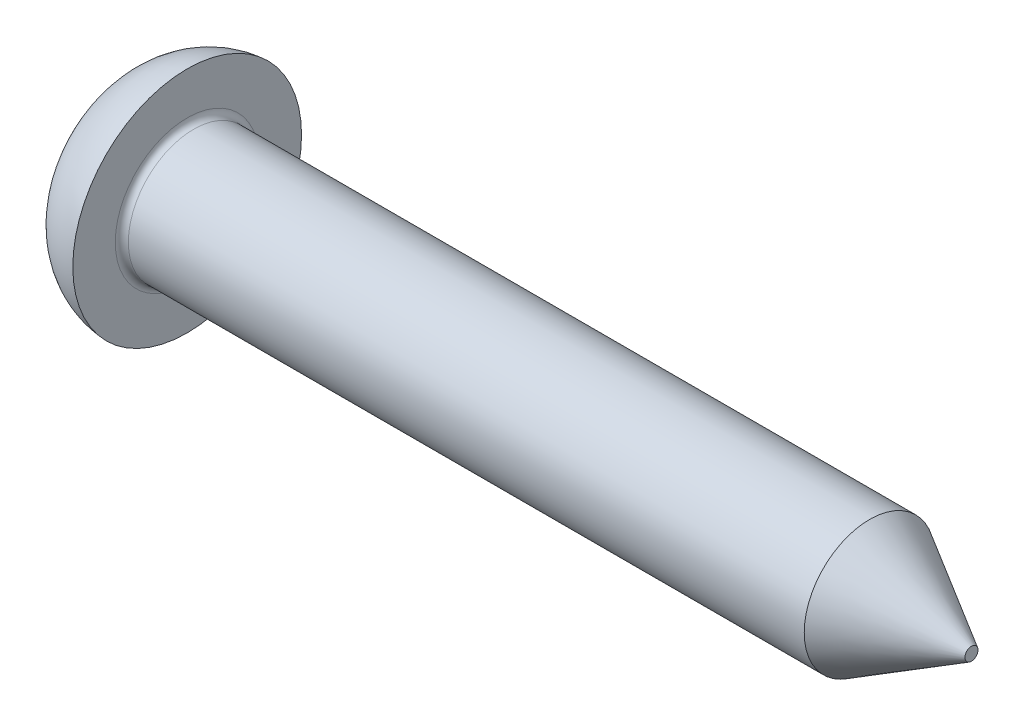
ISO-10303-21;
HEADER;
FILE_DESCRIPTION(('STEP AP214'),'2;1');
FILE_NAME('part.step','',(''),(''),'','','');
FILE_SCHEMA(('AUTOMOTIVE_DESIGN { 1 0 10303 214 1 1 1 1 }'));
ENDSEC;
DATA;
#1=APPLICATION_CONTEXT('core data for automotive mechanical design processes');
#2=APPLICATION_PROTOCOL_DEFINITION('international standard','automotive_design',2000,#1);
#3=PRODUCT_CONTEXT('',#1,'mechanical');
#4=PRODUCT('Part','Part','',(#3));
#5=PRODUCT_RELATED_PRODUCT_CATEGORY('part','',(#4));
#6=PRODUCT_DEFINITION_FORMATION('','',#4);
#7=PRODUCT_DEFINITION_CONTEXT('part definition',#1,'design');
#8=PRODUCT_DEFINITION('design','',#6,#7);
#9=PRODUCT_DEFINITION_SHAPE('','',#8);
#10=(LENGTH_UNIT() NAMED_UNIT(*) SI_UNIT(.MILLI.,.METRE.));
#11=(NAMED_UNIT(*) PLANE_ANGLE_UNIT() SI_UNIT($,.RADIAN.));
#12=(NAMED_UNIT(*) SI_UNIT($,.STERADIAN.) SOLID_ANGLE_UNIT());
#13=UNCERTAINTY_MEASURE_WITH_UNIT(LENGTH_MEASURE(1.E-05),#10,'distance_accuracy_value','');
#14=(GEOMETRIC_REPRESENTATION_CONTEXT(3) GLOBAL_UNCERTAINTY_ASSIGNED_CONTEXT((#13)) GLOBAL_UNIT_ASSIGNED_CONTEXT((#10,
#11,#12)) REPRESENTATION_CONTEXT('',''));
#15=CARTESIAN_POINT('',(0.,0.,0.));
#16=DIRECTION('',(0.,0.,1.));
#17=DIRECTION('',(1.,0.,0.));
#18=AXIS2_PLACEMENT_3D('',#15,#16,#17);
#19=CARTESIAN_POINT('',(2.1,0.,0.));
#20=DIRECTION('',(-1.,0.,0.));
#21=DIRECTION('',(0.,1.,0.));
#22=AXIS2_PLACEMENT_3D('',#19,#20,#21);
#23=SPHERICAL_SURFACE('',#22,2.1);
#24=CARTESIAN_POINT('',(0.443908039957306,0.,0.));
#25=DIRECTION('',(-1.,0.,0.));
#26=DIRECTION('',(0.,0.,1.));
#27=AXIS2_PLACEMENT_3D('',#24,#25,#26);
#28=CIRCLE('',#27,1.2912627230281);
#29=CARTESIAN_POINT('',(0.443908039957306,0.,1.2912627230281));
#30=VERTEX_POINT('',#29);
#31=EDGE_CURVE('E208',#30,#30,#28,.T.);
#32=ORIENTED_EDGE('',*,*,#31,.T.);
#33=EDGE_LOOP('',(#32));
#34=FACE_BOUND('',#33,.T.);
#35=CARTESIAN_POINT('',(0.0613546050321745,0.,0.));
#36=DIRECTION('',(1.,0.,0.));
#37=DIRECTION('',(0.,0.,-1.));
#38=AXIS2_PLACEMENT_3D('',#35,#36,#37);
#39=CIRCLE('',#38,0.503909668072047);
#40=CARTESIAN_POINT('',(0.061354605032363,-0.231,-0.447843670913397));
#41=VERTEX_POINT('',#40);
#42=CARTESIAN_POINT('',(0.0613546050321748,-0.447843670912608,-0.231));
#43=VERTEX_POINT('',#42);
#44=EDGE_CURVE('E392',#41,#43,#39,.F.);
#45=ORIENTED_EDGE('',*,*,#44,.F.);
#46=CARTESIAN_POINT('',(2.1,-0.231,0.));
#47=DIRECTION('',(0.,1.,0.));
#48=DIRECTION('',(0.,0.,1.));
#49=AXIS2_PLACEMENT_3D('',#46,#47,#48);
#50=CIRCLE('',#49,2.08725633308417);
#51=CARTESIAN_POINT('',(0.233233534269021,-0.230999999999997,-0.933714068878837));
#52=VERTEX_POINT('',#51);
#53=EDGE_CURVE('E411',#52,#41,#50,.T.);
#54=ORIENTED_EDGE('',*,*,#53,.F.);
#55=CARTESIAN_POINT('',(2.10118948688328,0.,-0.00238574199887259));
#56=DIRECTION('',(-0.446197753347435,0.,0.894934391398443));
#57=DIRECTION('',(0.894934391398443,0.,0.446197753347435));
#58=AXIS2_PLACEMENT_3D('',#55,#56,#57);
#59=CIRCLE('',#58,2.09999830794124);
#60=CARTESIAN_POINT('',(0.233233534269022,0.231000000000003,-0.933714068878836));
#61=VERTEX_POINT('',#60);
#62=EDGE_CURVE('E224',#61,#52,#59,.T.);
#63=ORIENTED_EDGE('',*,*,#62,.F.);
#64=CARTESIAN_POINT('',(2.1,0.231,0.));
#65=DIRECTION('',(0.,-1.,0.));
#66=DIRECTION('',(0.,0.,-1.));
#67=AXIS2_PLACEMENT_3D('',#64,#65,#66);
#68=CIRCLE('',#67,2.08725633308417);
#69=CARTESIAN_POINT('',(0.0613546050323631,0.231,-0.447843670913395));
#70=VERTEX_POINT('',#69);
#71=EDGE_CURVE('E402',#70,#61,#68,.T.);
#72=ORIENTED_EDGE('',*,*,#71,.F.);
#73=CARTESIAN_POINT('',(0.0613546050321748,0.447843670912608,-0.231));
#74=VERTEX_POINT('',#73);
#75=EDGE_CURVE('E283',#74,#70,#39,.F.);
#76=ORIENTED_EDGE('',*,*,#75,.F.);
#77=CARTESIAN_POINT('',(2.1,0.,-0.231));
#78=DIRECTION('',(0.,0.,1.));
#79=DIRECTION('',(1.,0.,0.));
#80=AXIS2_PLACEMENT_3D('',#77,#78,#79);
#81=CIRCLE('',#80,2.08725633308417);
#82=CARTESIAN_POINT('',(0.233233534269021,0.933714068878837,-0.231));
#83=VERTEX_POINT('',#82);
#84=EDGE_CURVE('E214',#83,#74,#81,.T.);
#85=ORIENTED_EDGE('',*,*,#84,.F.);
#86=CARTESIAN_POINT('',(2.10118948688328,0.00238574199887211,0.));
#87=DIRECTION('',(-0.446197753347436,-0.894934391398443,0.));
#88=DIRECTION('',(0.894934391398443,-0.446197753347436,0.));
#89=AXIS2_PLACEMENT_3D('',#86,#87,#88);
#90=CIRCLE('',#89,2.09999830794124);
#91=CARTESIAN_POINT('',(0.233233534269022,0.933714068878837,0.231));
#92=VERTEX_POINT('',#91);
#93=EDGE_CURVE('E205',#92,#83,#90,.T.);
#94=ORIENTED_EDGE('',*,*,#93,.F.);
#95=CARTESIAN_POINT('',(2.1,0.,0.231));
#96=DIRECTION('',(0.,0.,-1.));
#97=DIRECTION('',(-1.,0.,0.));
#98=AXIS2_PLACEMENT_3D('',#95,#96,#97);
#99=CIRCLE('',#98,2.08725633308417);
#100=CARTESIAN_POINT('',(0.0613546050321748,0.447843670912608,0.231));
#101=VERTEX_POINT('',#100);
#102=EDGE_CURVE('E56',#101,#92,#99,.T.);
#103=ORIENTED_EDGE('',*,*,#102,.F.);
#104=CARTESIAN_POINT('',(0.061354605032363,0.231,0.447843670913396));
#105=VERTEX_POINT('',#104);
#106=EDGE_CURVE('E391',#105,#101,#39,.F.);
#107=ORIENTED_EDGE('',*,*,#106,.F.);
#108=CARTESIAN_POINT('',(0.233233534269021,0.230999999999997,0.933714068878838));
#109=VERTEX_POINT('',#108);
#110=EDGE_CURVE('E407',#109,#105,#68,.T.);
#111=ORIENTED_EDGE('',*,*,#110,.F.);
#112=CARTESIAN_POINT('',(2.10118948688328,0.,0.0023857419988722));
#113=DIRECTION('',(-0.446197753347436,0.,-0.894934391398443));
#114=DIRECTION('',(-0.894934391398443,0.,0.446197753347436));
#115=AXIS2_PLACEMENT_3D('',#112,#113,#114);
#116=CIRCLE('',#115,2.09999830794124);
#117=CARTESIAN_POINT('',(0.233233534269022,-0.231000000000004,0.933714068878836));
#118=VERTEX_POINT('',#117);
#119=EDGE_CURVE('E222',#118,#109,#116,.T.);
#120=ORIENTED_EDGE('',*,*,#119,.F.);
#121=CARTESIAN_POINT('',(0.0613546050323631,-0.231,0.447843670913395));
#122=VERTEX_POINT('',#121);
#123=EDGE_CURVE('E344',#122,#118,#50,.T.);
#124=ORIENTED_EDGE('',*,*,#123,.F.);
#125=CARTESIAN_POINT('',(0.0613546050321748,-0.447843670912608,0.231));
#126=VERTEX_POINT('',#125);
#127=EDGE_CURVE('E387',#126,#122,#39,.F.);
#128=ORIENTED_EDGE('',*,*,#127,.F.);
#129=CARTESIAN_POINT('',(0.233233534269021,-0.933714068878836,0.231));
#130=VERTEX_POINT('',#129);
#131=EDGE_CURVE('E217',#130,#126,#99,.T.);
#132=ORIENTED_EDGE('',*,*,#131,.F.);
#133=CARTESIAN_POINT('',(2.10118948688328,-0.00238574199887259,0.));
#134=DIRECTION('',(-0.446197753347435,0.894934391398443,0.));
#135=DIRECTION('',(-0.894934391398443,-0.446197753347435,0.));
#136=AXIS2_PLACEMENT_3D('',#133,#134,#135);
#137=CIRCLE('',#136,2.09999830794124);
#138=CARTESIAN_POINT('',(0.233233534269022,-0.933714068878836,-0.231));
#139=VERTEX_POINT('',#138);
#140=EDGE_CURVE('E220',#139,#130,#137,.T.);
#141=ORIENTED_EDGE('',*,*,#140,.F.);
#142=EDGE_CURVE('E213',#43,#139,#81,.T.);
#143=ORIENTED_EDGE('',*,*,#142,.F.);
#144=EDGE_LOOP('',(#45,#54,#63,#72,#76,#85,#94,#103,#107,#111,#120,#124,#128,#132,#141,#143));
#145=FACE_BOUND('',#144,.T.);
#146=ADVANCED_FACE('F33',(#34,#145),#23,.T.);
#147=CARTESIAN_POINT('',(0.91,-0.596290812545844,0.231));
#148=DIRECTION('',(0.,0.,-1.));
#149=DIRECTION('',(-1.,0.,0.));
#150=AXIS2_PLACEMENT_3D('',#147,#148,#149);
#151=PLANE('',#150);
#152=ORIENTED_EDGE('',*,*,#131,.T.);
#153=CARTESIAN_POINT('',(0.0253406192590715,-0.450675416027531,0.231));
#154=CARTESIAN_POINT('',(0.17283619096145,-0.439104263502818,0.231));
#155=CARTESIAN_POINT('',(0.320322255429265,-0.42741437619178,0.231));
#156=CARTESIAN_POINT('',(0.615275382344517,-0.403797131000269,0.231));
#157=CARTESIAN_POINT('',(0.762742444790347,-0.391869773099751,0.231));
#158=CARTESIAN_POINT('',(0.91020000000001,-0.379823680392863,0.231));
#159=B_SPLINE_CURVE_WITH_KNOTS('',3,(#153,#154,#155,#156,#157,#158),.UNSPECIFIED.,.F.,.F.,(4,2,
4),(0.,0.443845844970914,0.887691727407606),.UNSPECIFIED.);
#160=CARTESIAN_POINT('',(0.91,-0.379840049022659,0.231));
#161=VERTEX_POINT('',#160);
#162=EDGE_CURVE('E261',#126,#161,#159,.T.);
#163=ORIENTED_EDGE('',*,*,#162,.T.);
#164=DIRECTION('',(0.,1.,0.));
#165=VECTOR('',#164,1.);
#166=CARTESIAN_POINT('',(0.91,-0.596290812545844,0.231));
#167=LINE('',#166,#165);
#168=CARTESIAN_POINT('',(0.91,-0.596290812545844,0.231));
#169=VERTEX_POINT('',#168);
#170=EDGE_CURVE('E341',#161,#169,#167,.F.);
#171=ORIENTED_EDGE('',*,*,#170,.T.);
#172=DIRECTION('',(0.894934391398443,0.446197753347436,0.));
#173=VECTOR('',#172,1.);
#174=CARTESIAN_POINT('',(0.,-1.05,0.231));
#175=LINE('',#174,#173);
#176=EDGE_CURVE('E366',#130,#169,#175,.T.);
#177=ORIENTED_EDGE('',*,*,#176,.F.);
#178=EDGE_LOOP('',(#152,#163,#171,#177));
#179=FACE_BOUND('',#178,.T.);
#180=ADVANCED_FACE('F163',(#179),#151,.T.);
#181=DIRECTION('',(0.,1.,0.));
#182=VECTOR('',#181,1.);
#183=CARTESIAN_POINT('',(0.91,-0.596290812545844,0.231));
#184=LINE('',#183,#182);
#185=CARTESIAN_POINT('',(0.91,0.596290812545845,0.231));
#186=VERTEX_POINT('',#185);
#187=CARTESIAN_POINT('',(0.91,0.379840049022659,0.231));
#188=VERTEX_POINT('',#187);
#189=EDGE_CURVE('E343',#186,#188,#184,.F.);
#190=ORIENTED_EDGE('',*,*,#189,.T.);
#191=CARTESIAN_POINT('',(0.9102,0.379823680392733,0.231));
#192=CARTESIAN_POINT('',(0.762742444790341,0.391869773099674,0.231));
#193=CARTESIAN_POINT('',(0.615275382344514,0.403797131000236,0.231));
#194=CARTESIAN_POINT('',(0.320322255429268,0.427414376191813,0.231));
#195=CARTESIAN_POINT('',(0.172836190961454,0.439104263502874,0.231));
#196=CARTESIAN_POINT('',(0.0253406192590771,0.450675416027601,0.231));
#197=B_SPLINE_CURVE_WITH_KNOTS('',3,(#191,#192,#193,#194,#195,#196),.UNSPECIFIED.,.F.,.F.,(4,2,
4),(0.,0.443845882436693,0.887691727407607),.UNSPECIFIED.);
#198=EDGE_CURVE('E248',#188,#101,#197,.T.);
#199=ORIENTED_EDGE('',*,*,#198,.T.);
#200=ORIENTED_EDGE('',*,*,#102,.T.);
#201=DIRECTION('',(0.894934391398443,-0.446197753347436,0.));
#202=VECTOR('',#201,1.);
#203=CARTESIAN_POINT('',(0.,1.05,0.231));
#204=LINE('',#203,#202);
#205=EDGE_CURVE('E356',#92,#186,#204,.T.);
#206=ORIENTED_EDGE('',*,*,#205,.T.);
#207=EDGE_LOOP('',(#190,#199,#200,#206));
#208=FACE_BOUND('',#207,.T.);
#209=ADVANCED_FACE('F170',(#208),#151,.T.);
#210=CARTESIAN_POINT('',(0.91,0.596290812545845,-0.231));
#211=DIRECTION('',(0.,0.,1.));
#212=DIRECTION('',(1.,0.,0.));
#213=AXIS2_PLACEMENT_3D('',#210,#211,#212);
#214=PLANE('',#213);
#215=DIRECTION('',(0.,1.,0.));
#216=VECTOR('',#215,1.);
#217=CARTESIAN_POINT('',(0.91,0.596290812545845,-0.231));
#218=LINE('',#217,#216);
#219=CARTESIAN_POINT('',(0.91,-0.596290812545845,-0.231));
#220=VERTEX_POINT('',#219);
#221=CARTESIAN_POINT('',(0.91,-0.379840049022659,-0.231));
#222=VERTEX_POINT('',#221);
#223=EDGE_CURVE('E351',#220,#222,#218,.T.);
#224=ORIENTED_EDGE('',*,*,#223,.T.);
#225=CARTESIAN_POINT('',(0.9102,-0.379823680392733,-0.231));
#226=CARTESIAN_POINT('',(0.762742444790341,-0.391869773099674,-0.231));
#227=CARTESIAN_POINT('',(0.615275382344514,-0.403797131000235,-0.231));
#228=CARTESIAN_POINT('',(0.320322255429268,-0.427414376191813,-0.231));
#229=CARTESIAN_POINT('',(0.172836190961455,-0.439104263502874,-0.231));
#230=CARTESIAN_POINT('',(0.0253406192590774,-0.450675416027601,-0.231));
#231=B_SPLINE_CURVE_WITH_KNOTS('',3,(#225,#226,#227,#228,#229,#230),.UNSPECIFIED.,.F.,.F.,(4,2,
4),(0.,0.443845882436692,0.887691727407606),.UNSPECIFIED.);
#232=EDGE_CURVE('E272',#222,#43,#231,.T.);
#233=ORIENTED_EDGE('',*,*,#232,.T.);
#234=ORIENTED_EDGE('',*,*,#142,.T.);
#235=DIRECTION('',(0.894934391398443,0.446197753347435,0.));
#236=VECTOR('',#235,1.);
#237=CARTESIAN_POINT('',(0.,-1.05,-0.231));
#238=LINE('',#237,#236);
#239=EDGE_CURVE('E362',#139,#220,#238,.T.);
#240=ORIENTED_EDGE('',*,*,#239,.T.);
#241=EDGE_LOOP('',(#224,#233,#234,#240));
#242=FACE_BOUND('',#241,.T.);
#243=ADVANCED_FACE('F293',(#242),#214,.T.);
#244=ORIENTED_EDGE('',*,*,#84,.T.);
#245=CARTESIAN_POINT('',(0.0253406192590715,0.45067541602753,-0.231));
#246=CARTESIAN_POINT('',(0.17283619096145,0.439104263502817,-0.231));
#247=CARTESIAN_POINT('',(0.320322255429265,0.427414376191779,-0.231));
#248=CARTESIAN_POINT('',(0.615275382344517,0.403797131000269,-0.231));
#249=CARTESIAN_POINT('',(0.762742444790347,0.391869773099751,-0.231));
#250=CARTESIAN_POINT('',(0.91020000000001,0.379823680392863,-0.231));
#251=B_SPLINE_CURVE_WITH_KNOTS('',3,(#245,#246,#247,#248,#249,#250),.UNSPECIFIED.,.F.,.F.,(4,2,
4),(0.,0.443845844970914,0.887691727407606),.UNSPECIFIED.);
#252=CARTESIAN_POINT('',(0.91,0.379840049022659,-0.231));
#253=VERTEX_POINT('',#252);
#254=EDGE_CURVE('E284',#74,#253,#251,.T.);
#255=ORIENTED_EDGE('',*,*,#254,.T.);
#256=DIRECTION('',(0.,1.,0.));
#257=VECTOR('',#256,1.);
#258=CARTESIAN_POINT('',(0.91,0.596290812545845,-0.231));
#259=LINE('',#258,#257);
#260=CARTESIAN_POINT('',(0.91,0.596290812545845,-0.231));
#261=VERTEX_POINT('',#260);
#262=EDGE_CURVE('E350',#253,#261,#259,.T.);
#263=ORIENTED_EDGE('',*,*,#262,.T.);
#264=DIRECTION('',(0.894934391398443,-0.446197753347436,0.));
#265=VECTOR('',#264,1.);
#266=CARTESIAN_POINT('',(0.,1.05,-0.231));
#267=LINE('',#266,#265);
#268=EDGE_CURVE('E360',#83,#261,#267,.T.);
#269=ORIENTED_EDGE('',*,*,#268,.F.);
#270=EDGE_LOOP('',(#244,#255,#263,#269));
#271=FACE_BOUND('',#270,.T.);
#272=ADVANCED_FACE('F297',(#271),#214,.T.);
#273=CARTESIAN_POINT('',(0.91,0.596290812545845,0.231));
#274=DIRECTION('',(1.,0.,0.));
#275=DIRECTION('',(0.,0.,-1.));
#276=AXIS2_PLACEMENT_3D('',#273,#274,#275);
#277=PLANE('',#276);
#278=CARTESIAN_POINT('',(0.91,0.,0.));
#279=DIRECTION('',(-1.,0.,0.));
#280=DIRECTION('',(0.,0.,1.));
#281=AXIS2_PLACEMENT_3D('',#278,#279,#280);
#282=CIRCLE('',#281,0.444566601131412);
#283=EDGE_CURVE('E380',#222,#161,#282,.T.);
#284=ORIENTED_EDGE('',*,*,#283,.F.);
#285=ORIENTED_EDGE('',*,*,#223,.F.);
#286=DIRECTION('',(0.,0.,1.));
#287=VECTOR('',#286,1.);
#288=CARTESIAN_POINT('',(0.910000000000001,-0.596290812545845,-0.231));
#289=LINE('',#288,#287);
#290=EDGE_CURVE('E347',#169,#220,#289,.F.);
#291=ORIENTED_EDGE('',*,*,#290,.F.);
#292=ORIENTED_EDGE('',*,*,#170,.F.);
#293=EDGE_LOOP('',(#284,#285,#291,#292));
#294=FACE_BOUND('',#293,.T.);
#295=ADVANCED_FACE('F304',(#294),#277,.F.);
#296=CARTESIAN_POINT('',(0.91,-0.231,0.379840049022659));
#297=VERTEX_POINT('',#296);
#298=CARTESIAN_POINT('',(0.91,0.231,0.379840049022661));
#299=VERTEX_POINT('',#298);
#300=EDGE_CURVE('E446',#297,#299,#282,.T.);
#301=ORIENTED_EDGE('',*,*,#300,.F.);
#302=DIRECTION('',(0.,0.,1.));
#303=VECTOR('',#302,1.);
#304=CARTESIAN_POINT('',(0.91,-0.231,-0.596290812545845));
#305=LINE('',#304,#303);
#306=CARTESIAN_POINT('',(0.91,-0.231,0.596290812545844));
#307=VERTEX_POINT('',#306);
#308=EDGE_CURVE('E326',#307,#297,#305,.F.);
#309=ORIENTED_EDGE('',*,*,#308,.F.);
#310=DIRECTION('',(0.,-1.,0.));
#311=VECTOR('',#310,1.);
#312=CARTESIAN_POINT('',(0.91,-0.231,0.596290812545844));
#313=LINE('',#312,#311);
#314=CARTESIAN_POINT('',(0.91,0.230999999999998,0.596290812545845));
#315=VERTEX_POINT('',#314);
#316=EDGE_CURVE('E337',#315,#307,#313,.T.);
#317=ORIENTED_EDGE('',*,*,#316,.F.);
#318=DIRECTION('',(0.,0.,1.));
#319=VECTOR('',#318,1.);
#320=CARTESIAN_POINT('',(0.91,0.230999999999998,0.596290812545845));
#321=LINE('',#320,#319);
#322=EDGE_CURVE('E332',#299,#315,#321,.T.);
#323=ORIENTED_EDGE('',*,*,#322,.F.);
#324=EDGE_LOOP('',(#301,#309,#317,#323));
#325=FACE_BOUND('',#324,.T.);
#326=ADVANCED_FACE('F306',(#325),#277,.F.);
#327=EDGE_CURVE('E445',#188,#253,#282,.T.);
#328=ORIENTED_EDGE('',*,*,#327,.F.);
#329=ORIENTED_EDGE('',*,*,#189,.F.);
#330=DIRECTION('',(0.,0.,1.));
#331=VECTOR('',#330,1.);
#332=CARTESIAN_POINT('',(0.91,0.596290812545845,0.231));
#333=LINE('',#332,#331);
#334=EDGE_CURVE('E233',#261,#186,#333,.T.);
#335=ORIENTED_EDGE('',*,*,#334,.F.);
#336=ORIENTED_EDGE('',*,*,#262,.F.);
#337=EDGE_LOOP('',(#328,#329,#335,#336));
#338=FACE_BOUND('',#337,.T.);
#339=ADVANCED_FACE('F453',(#338),#277,.F.);
#340=CARTESIAN_POINT('',(0.91,0.231,-0.379840049022659));
#341=VERTEX_POINT('',#340);
#342=CARTESIAN_POINT('',(0.91,-0.231,-0.37984004902266));
#343=VERTEX_POINT('',#342);
#344=EDGE_CURVE('E438',#341,#343,#282,.T.);
#345=ORIENTED_EDGE('',*,*,#344,.F.);
#346=DIRECTION('',(0.,0.,1.));
#347=VECTOR('',#346,1.);
#348=CARTESIAN_POINT('',(0.91,0.230999999999998,0.596290812545845));
#349=LINE('',#348,#347);
#350=CARTESIAN_POINT('',(0.91,0.231,-0.596290812545844));
#351=VERTEX_POINT('',#350);
#352=EDGE_CURVE('E334',#351,#341,#349,.T.);
#353=ORIENTED_EDGE('',*,*,#352,.F.);
#354=DIRECTION('',(0.,-1.,0.));
#355=VECTOR('',#354,1.);
#356=CARTESIAN_POINT('',(0.910000000000001,0.231000000000002,-0.596290812545845));
#357=LINE('',#356,#355);
#358=CARTESIAN_POINT('',(0.91,-0.231,-0.596290812545845));
#359=VERTEX_POINT('',#358);
#360=EDGE_CURVE('E329',#359,#351,#357,.F.);
#361=ORIENTED_EDGE('',*,*,#360,.F.);
#362=DIRECTION('',(0.,0.,1.));
#363=VECTOR('',#362,1.);
#364=CARTESIAN_POINT('',(0.91,-0.231,-0.596290812545845));
#365=LINE('',#364,#363);
#366=EDGE_CURVE('E290',#343,#359,#365,.F.);
#367=ORIENTED_EDGE('',*,*,#366,.F.);
#368=EDGE_LOOP('',(#345,#353,#361,#367));
#369=FACE_BOUND('',#368,.T.);
#370=ADVANCED_FACE('F308',(#369),#277,.F.);
#371=CARTESIAN_POINT('',(0.91,0.230999999999998,0.596290812545845));
#372=DIRECTION('',(0.,-1.,0.));
#373=DIRECTION('',(1.,0.,0.));
#374=AXIS2_PLACEMENT_3D('',#371,#372,#373);
#375=PLANE('',#374);
#376=ORIENTED_EDGE('',*,*,#352,.T.);
#377=CARTESIAN_POINT('',(0.9102,0.231,-0.379823680392733));
#378=CARTESIAN_POINT('',(0.762742444790341,0.231000000000001,-0.391869773099674));
#379=CARTESIAN_POINT('',(0.615275382344514,0.231000000000001,-0.403797131000235));
#380=CARTESIAN_POINT('',(0.320322255429268,0.231000000000001,-0.427414376191812));
#381=CARTESIAN_POINT('',(0.172836190961455,0.231000000000001,-0.439104263502873));
#382=CARTESIAN_POINT('',(0.0253406192590774,0.231,-0.4506754160276));
#383=B_SPLINE_CURVE_WITH_KNOTS('',3,(#377,#378,#379,#380,#381,#382),.UNSPECIFIED.,.F.,.F.,(4,2,
4),(0.,0.443845882436692,0.887691727407606),.UNSPECIFIED.);
#384=EDGE_CURVE('E278',#341,#70,#383,.T.);
#385=ORIENTED_EDGE('',*,*,#384,.T.);
#386=ORIENTED_EDGE('',*,*,#71,.T.);
#387=DIRECTION('',(0.894934391398443,0.,0.446197753347435));
#388=VECTOR('',#387,1.);
#389=CARTESIAN_POINT('',(0.,0.231000000000004,-1.05));
#390=LINE('',#389,#388);
#391=EDGE_CURVE('E413',#61,#351,#390,.T.);
#392=ORIENTED_EDGE('',*,*,#391,.T.);
#393=EDGE_LOOP('',(#376,#385,#386,#392));
#394=FACE_BOUND('',#393,.T.);
#395=ADVANCED_FACE('F235',(#394),#375,.T.);
#396=CARTESIAN_POINT('',(0.91,-0.231,-0.596290812545845));
#397=DIRECTION('',(0.,1.,0.));
#398=DIRECTION('',(-1.,0.,0.));
#399=AXIS2_PLACEMENT_3D('',#396,#397,#398);
#400=PLANE('',#399);
#401=ORIENTED_EDGE('',*,*,#53,.T.);
#402=CARTESIAN_POINT('',(0.0253406192590715,-0.231,-0.450675416027531));
#403=CARTESIAN_POINT('',(0.17283619096145,-0.231,-0.439104263502817));
#404=CARTESIAN_POINT('',(0.320322255429266,-0.231,-0.427414376191779));
#405=CARTESIAN_POINT('',(0.615275382344517,-0.231,-0.403797131000269));
#406=CARTESIAN_POINT('',(0.762742444790348,-0.231,-0.391869773099751));
#407=CARTESIAN_POINT('',(0.910200000000011,-0.231,-0.379823680392863));
#408=B_SPLINE_CURVE_WITH_KNOTS('',3,(#402,#403,#404,#405,#406,#407),.UNSPECIFIED.,.F.,.F.,(4,2,
4),(0.,0.443845844970915,0.887691727407607),.UNSPECIFIED.);
#409=EDGE_CURVE('E267',#41,#343,#408,.T.);
#410=ORIENTED_EDGE('',*,*,#409,.T.);
#411=ORIENTED_EDGE('',*,*,#366,.T.);
#412=DIRECTION('',(0.894934391398443,0.,0.446197753347436));
#413=VECTOR('',#412,1.);
#414=CARTESIAN_POINT('',(0.,-0.230999999999996,-1.05));
#415=LINE('',#414,#413);
#416=EDGE_CURVE('E408',#52,#359,#415,.T.);
#417=ORIENTED_EDGE('',*,*,#416,.F.);
#418=EDGE_LOOP('',(#401,#410,#411,#417));
#419=FACE_BOUND('',#418,.T.);
#420=ADVANCED_FACE('F439',(#419),#400,.T.);
#421=ORIENTED_EDGE('',*,*,#308,.T.);
#422=CARTESIAN_POINT('',(0.9102,-0.231,0.379823680392732));
#423=CARTESIAN_POINT('',(0.762742444790341,-0.231000000000002,0.391869773099673));
#424=CARTESIAN_POINT('',(0.615275382344514,-0.231000000000003,0.403797131000234));
#425=CARTESIAN_POINT('',(0.320322255429268,-0.231000000000003,0.427414376191811));
#426=CARTESIAN_POINT('',(0.172836190961455,-0.231000000000002,0.439104263502873));
#427=CARTESIAN_POINT('',(0.0253406192590775,-0.231,0.4506754160276));
#428=B_SPLINE_CURVE_WITH_KNOTS('',3,(#422,#423,#424,#425,#426,#427),.UNSPECIFIED.,.F.,.F.,(4,2,
4),(0.,0.443845882436692,0.887691727407606),.UNSPECIFIED.);
#429=EDGE_CURVE('E255',#297,#122,#428,.T.);
#430=ORIENTED_EDGE('',*,*,#429,.T.);
#431=ORIENTED_EDGE('',*,*,#123,.T.);
#432=DIRECTION('',(0.894934391398443,0.,-0.446197753347436));
#433=VECTOR('',#432,1.);
#434=CARTESIAN_POINT('',(0.,-0.231000000000004,1.05));
#435=LINE('',#434,#433);
#436=EDGE_CURVE('E340',#118,#307,#435,.T.);
#437=ORIENTED_EDGE('',*,*,#436,.T.);
#438=EDGE_LOOP('',(#421,#430,#431,#437));
#439=FACE_BOUND('',#438,.T.);
#440=ADVANCED_FACE('F421',(#439),#400,.T.);
#441=ORIENTED_EDGE('',*,*,#110,.T.);
#442=CARTESIAN_POINT('',(0.0253406192590711,0.231,0.450675416027531));
#443=CARTESIAN_POINT('',(0.172836190961449,0.230999999999999,0.439104263502818));
#444=CARTESIAN_POINT('',(0.320322255429265,0.230999999999998,0.427414376191781));
#445=CARTESIAN_POINT('',(0.615275382344516,0.230999999999998,0.40379713100027));
#446=CARTESIAN_POINT('',(0.762742444790347,0.230999999999999,0.391869773099752));
#447=CARTESIAN_POINT('',(0.91020000000001,0.231,0.379823680392864));
#448=B_SPLINE_CURVE_WITH_KNOTS('',3,(#442,#443,#444,#445,#446,#447),.UNSPECIFIED.,.F.,.F.,(4,2,
4),(0.,0.443845844970914,0.887691727407607),.UNSPECIFIED.);
#449=EDGE_CURVE('E226',#105,#299,#448,.T.);
#450=ORIENTED_EDGE('',*,*,#449,.T.);
#451=ORIENTED_EDGE('',*,*,#322,.T.);
#452=DIRECTION('',(0.894934391398443,0.,-0.446197753347436));
#453=VECTOR('',#452,1.);
#454=CARTESIAN_POINT('',(0.,0.230999999999996,1.05));
#455=LINE('',#454,#453);
#456=EDGE_CURVE('E291',#109,#315,#455,.T.);
#457=ORIENTED_EDGE('',*,*,#456,.F.);
#458=EDGE_LOOP('',(#441,#450,#451,#457));
#459=FACE_BOUND('',#458,.T.);
#460=ADVANCED_FACE('F318',(#459),#375,.T.);
#461=CARTESIAN_POINT('',(13.3,1.,0.));
#462=DIRECTION('',(-1.,0.,0.));
#463=DIRECTION('',(0.,0.,1.));
#464=AXIS2_PLACEMENT_3D('',#461,#462,#463);
#465=PLANE('',#464);
#466=CARTESIAN_POINT('',(13.3,0.,0.));
#467=DIRECTION('',(-1.,0.,0.));
#468=DIRECTION('',(0.,0.,1.));
#469=AXIS2_PLACEMENT_3D('',#466,#467,#468);
#470=CIRCLE('',#469,0.0999999999999994);
#471=CARTESIAN_POINT('',(13.3,0.,0.0999999999999989));
#472=VERTEX_POINT('',#471);
#473=EDGE_CURVE('E11',#472,#472,#470,.F.);
#474=ORIENTED_EDGE('',*,*,#473,.T.);
#475=EDGE_LOOP('',(#474));
#476=FACE_BOUND('',#475,.T.);
#477=ADVANCED_FACE('F176',(#476),#465,.F.);
#478=CARTESIAN_POINT('',(0.,0.,0.));
#479=DIRECTION('',(-1.,0.,0.));
#480=DIRECTION('',(0.,0.,1.));
#481=AXIS2_PLACEMENT_3D('',#478,#479,#480);
#482=CYLINDRICAL_SURFACE('',#481,1.);
#483=CARTESIAN_POINT('',(11.741154273188,0.,0.));
#484=DIRECTION('',(-1.,0.,0.));
#485=DIRECTION('',(0.,0.,1.));
#486=AXIS2_PLACEMENT_3D('',#483,#484,#485);
#487=CIRCLE('',#486,1.);
#488=CARTESIAN_POINT('',(11.741154273188,0.,1.));
#489=VERTEX_POINT('',#488);
#490=EDGE_CURVE('E41',#489,#489,#487,.T.);
#491=ORIENTED_EDGE('',*,*,#490,.T.);
#492=EDGE_LOOP('',(#491));
#493=FACE_BOUND('',#492,.T.);
#494=CARTESIAN_POINT('',(1.4,0.,0.));
#495=DIRECTION('',(-1.,0.,0.));
#496=DIRECTION('',(0.,0.,1.));
#497=AXIS2_PLACEMENT_3D('',#494,#495,#496);
#498=CIRCLE('',#497,1.);
#499=CARTESIAN_POINT('',(1.4,0.,1.));
#500=VERTEX_POINT('',#499);
#501=EDGE_CURVE('E198',#500,#500,#498,.F.);
#502=ORIENTED_EDGE('',*,*,#501,.T.);
#503=EDGE_LOOP('',(#502));
#504=FACE_BOUND('',#503,.T.);
#505=ADVANCED_FACE('F311',(#493,#504),#482,.T.);
#506=CARTESIAN_POINT('',(1.3,1.,0.));
#507=DIRECTION('',(-1.,0.,0.));
#508=DIRECTION('',(0.,0.,1.));
#509=AXIS2_PLACEMENT_3D('',#506,#507,#508);
#510=PLANE('',#509);
#511=CARTESIAN_POINT('',(1.3,0.,0.));
#512=DIRECTION('',(-1.,0.,0.));
#513=DIRECTION('',(0.,0.,1.));
#514=AXIS2_PLACEMENT_3D('',#511,#512,#513);
#515=CIRCLE('',#514,1.1);
#516=CARTESIAN_POINT('',(1.3,0.,1.1));
#517=VERTEX_POINT('',#516);
#518=EDGE_CURVE('E201',#517,#517,#515,.T.);
#519=ORIENTED_EDGE('',*,*,#518,.T.);
#520=EDGE_LOOP('',(#519));
#521=FACE_BOUND('',#520,.T.);
#522=CARTESIAN_POINT('',(1.3,0.,0.));
#523=DIRECTION('',(-1.,0.,0.));
#524=DIRECTION('',(0.,0.,1.));
#525=AXIS2_PLACEMENT_3D('',#522,#523,#524);
#526=CIRCLE('',#525,1.75);
#527=CARTESIAN_POINT('',(1.3,0.,1.75));
#528=VERTEX_POINT('',#527);
#529=EDGE_CURVE('E203',#528,#528,#526,.T.);
#530=ORIENTED_EDGE('',*,*,#529,.F.);
#531=EDGE_LOOP('',(#530));
#532=FACE_BOUND('',#531,.T.);
#533=ADVANCED_FACE('F192',(#521,#532),#510,.F.);
#534=CARTESIAN_POINT('',(1.39024630283885,0.,0.));
#535=DIRECTION('',(-1.,0.,0.));
#536=DIRECTION('',(0.,0.,1.));
#537=AXIS2_PLACEMENT_3D('',#534,#535,#536);
#538=DEGENERATE_TOROIDAL_SURFACE('',#537,0.553398309869187,1.2,.T.);
#539=ORIENTED_EDGE('',*,*,#31,.F.);
#540=EDGE_LOOP('',(#539));
#541=FACE_BOUND('',#540,.T.);
#542=ORIENTED_EDGE('',*,*,#529,.T.);
#543=EDGE_LOOP('',(#542));
#544=FACE_BOUND('',#543,.T.);
#545=ADVANCED_FACE('F181',(#541,#544),#538,.T.);
#546=CARTESIAN_POINT('',(1.4,0.,0.));
#547=DIRECTION('',(-1.,0.,0.));
#548=DIRECTION('',(0.,0.,1.));
#549=AXIS2_PLACEMENT_3D('',#546,#547,#548);
#550=TOROIDAL_SURFACE('',#549,1.1,0.1);
#551=ORIENTED_EDGE('',*,*,#501,.F.);
#552=EDGE_LOOP('',(#551));
#553=FACE_BOUND('',#552,.T.);
#554=ORIENTED_EDGE('',*,*,#518,.F.);
#555=EDGE_LOOP('',(#554));
#556=FACE_BOUND('',#555,.T.);
#557=ADVANCED_FACE('F178',(#553,#556),#550,.F.);
#558=CARTESIAN_POINT('',(0.,-1.05,-0.231));
#559=DIRECTION('',(-0.446197753347435,0.894934391398443,0.));
#560=DIRECTION('',(-0.894934391398443,-0.446197753347435,0.));
#561=AXIS2_PLACEMENT_3D('',#558,#559,#560);
#562=PLANE('',#561);
#563=ORIENTED_EDGE('',*,*,#140,.T.);
#564=ORIENTED_EDGE('',*,*,#176,.T.);
#565=ORIENTED_EDGE('',*,*,#290,.T.);
#566=ORIENTED_EDGE('',*,*,#239,.F.);
#567=EDGE_LOOP('',(#563,#564,#565,#566));
#568=FACE_BOUND('',#567,.T.);
#569=ADVANCED_FACE('F180',(#568),#562,.T.);
#570=CARTESIAN_POINT('',(0.91,0.596290812545845,0.231));
#571=DIRECTION('',(-0.446197753347436,-0.894934391398443,0.));
#572=DIRECTION('',(0.894934391398443,-0.446197753347436,0.));
#573=AXIS2_PLACEMENT_3D('',#570,#571,#572);
#574=PLANE('',#573);
#575=ORIENTED_EDGE('',*,*,#93,.T.);
#576=ORIENTED_EDGE('',*,*,#268,.T.);
#577=ORIENTED_EDGE('',*,*,#334,.T.);
#578=ORIENTED_EDGE('',*,*,#205,.F.);
#579=EDGE_LOOP('',(#575,#576,#577,#578));
#580=FACE_BOUND('',#579,.T.);
#581=ADVANCED_FACE('F188',(#580),#574,.T.);
#582=CARTESIAN_POINT('',(0.,0.231000000000004,-1.05));
#583=DIRECTION('',(-0.446197753347435,0.,0.894934391398443));
#584=DIRECTION('',(-0.894934391398443,0.,-0.446197753347435));
#585=AXIS2_PLACEMENT_3D('',#582,#583,#584);
#586=PLANE('',#585);
#587=ORIENTED_EDGE('',*,*,#62,.T.);
#588=ORIENTED_EDGE('',*,*,#416,.T.);
#589=ORIENTED_EDGE('',*,*,#360,.T.);
#590=ORIENTED_EDGE('',*,*,#391,.F.);
#591=EDGE_LOOP('',(#587,#588,#589,#590));
#592=FACE_BOUND('',#591,.T.);
#593=ADVANCED_FACE('F241',(#592),#586,.T.);
#594=CARTESIAN_POINT('',(0.91,-0.231,0.596290812545844));
#595=DIRECTION('',(-0.446197753347436,0.,-0.894934391398443));
#596=DIRECTION('',(0.894934391398443,0.,-0.446197753347436));
#597=AXIS2_PLACEMENT_3D('',#594,#595,#596);
#598=PLANE('',#597);
#599=ORIENTED_EDGE('',*,*,#119,.T.);
#600=ORIENTED_EDGE('',*,*,#456,.T.);
#601=ORIENTED_EDGE('',*,*,#316,.T.);
#602=ORIENTED_EDGE('',*,*,#436,.F.);
#603=EDGE_LOOP('',(#599,#600,#601,#602));
#604=FACE_BOUND('',#603,.T.);
#605=ADVANCED_FACE('F423',(#604),#598,.T.);
#606=CARTESIAN_POINT('',(0.91,0.,0.));
#607=DIRECTION('',(-1.,0.,0.));
#608=DIRECTION('',(0.,0.,1.));
#609=AXIS2_PLACEMENT_3D('',#606,#607,#608);
#610=CONICAL_SURFACE('',#609,0.444566601131412,0.0698131700797659);
#611=ORIENTED_EDGE('',*,*,#75,.T.);
#612=ORIENTED_EDGE('',*,*,#384,.F.);
#613=EDGE_CURVE('E444',#253,#341,#282,.T.);
#614=ORIENTED_EDGE('',*,*,#613,.F.);
#615=ORIENTED_EDGE('',*,*,#254,.F.);
#616=EDGE_LOOP('',(#611,#612,#614,#615));
#617=FACE_BOUND('',#616,.T.);
#618=ADVANCED_FACE('F161',(#617),#610,.F.);
#619=EDGE_CURVE('E442',#343,#222,#282,.T.);
#620=ORIENTED_EDGE('',*,*,#619,.F.);
#621=ORIENTED_EDGE('',*,*,#409,.F.);
#622=ORIENTED_EDGE('',*,*,#44,.T.);
#623=ORIENTED_EDGE('',*,*,#232,.F.);
#624=EDGE_LOOP('',(#620,#621,#622,#623));
#625=FACE_BOUND('',#624,.T.);
#626=ADVANCED_FACE('F440',(#625),#610,.F.);
#627=ORIENTED_EDGE('',*,*,#127,.T.);
#628=ORIENTED_EDGE('',*,*,#429,.F.);
#629=EDGE_CURVE('E447',#161,#297,#282,.T.);
#630=ORIENTED_EDGE('',*,*,#629,.F.);
#631=ORIENTED_EDGE('',*,*,#162,.F.);
#632=EDGE_LOOP('',(#627,#628,#630,#631));
#633=FACE_BOUND('',#632,.T.);
#634=ADVANCED_FACE('F159',(#633),#610,.F.);
#635=EDGE_CURVE('E48',#299,#188,#282,.T.);
#636=ORIENTED_EDGE('',*,*,#635,.F.);
#637=ORIENTED_EDGE('',*,*,#449,.F.);
#638=ORIENTED_EDGE('',*,*,#106,.T.);
#639=ORIENTED_EDGE('',*,*,#198,.F.);
#640=EDGE_LOOP('',(#636,#637,#638,#639));
#641=FACE_BOUND('',#640,.T.);
#642=ADVANCED_FACE('F150',(#641),#610,.F.);
#643=CARTESIAN_POINT('',(1.05444844499491,0.,0.));
#644=DIRECTION('',(-1.,0.,0.));
#645=DIRECTION('',(0.,0.,1.));
#646=AXIS2_PLACEMENT_3D('',#643,#644,#645);
#647=CONICAL_SURFACE('',#646,0.,1.25663706143592);
#648=ORIENTED_EDGE('',*,*,#635,.T.);
#649=ORIENTED_EDGE('',*,*,#327,.T.);
#650=ORIENTED_EDGE('',*,*,#613,.T.);
#651=ORIENTED_EDGE('',*,*,#344,.T.);
#652=ORIENTED_EDGE('',*,*,#619,.T.);
#653=ORIENTED_EDGE('',*,*,#283,.T.);
#654=ORIENTED_EDGE('',*,*,#629,.T.);
#655=ORIENTED_EDGE('',*,*,#300,.T.);
#656=EDGE_LOOP('',(#648,#649,#650,#651,#652,#653,#654,#655));
#657=FACE_BOUND('',#656,.T.);
#658=CARTESIAN_POINT('',(1.05444844499491,0.,0.));
#659=VERTEX_POINT('',#658);
#660=VERTEX_LOOP('',#659);
#661=FACE_BOUND('',#660,.T.);
#662=ADVANCED_FACE('F148',(#657,#661),#647,.F.);
#663=CARTESIAN_POINT('',(11.741154273188,0.,0.));
#664=DIRECTION('',(-1.,0.,0.));
#665=DIRECTION('',(0.,0.,1.));
#666=AXIS2_PLACEMENT_3D('',#663,#664,#665);
#667=CONICAL_SURFACE('',#666,1.,0.523598775598301);
#668=CARTESIAN_POINT('',(13.3,0.,0.0999999999999989));
#669=CARTESIAN_POINT('',(13.283762023679,0.,0.109374999999999));
#670=CARTESIAN_POINT('',(13.2675240473581,0.,0.118749999999999));
#671=CARTESIAN_POINT('',(13.2350480947162,0.,0.137499999999999));
#672=CARTESIAN_POINT('',(13.2188101183952,0.,0.146874999999999));
#673=CARTESIAN_POINT('',(13.1863341657533,0.,0.165624999999999));
#674=CARTESIAN_POINT('',(13.1700961894323,0.,0.174999999999999));
#675=CARTESIAN_POINT('',(13.1376202367904,0.,0.193749999999999));
#676=CARTESIAN_POINT('',(13.1213822604695,0.,0.203124999999999));
#677=CARTESIAN_POINT('',(13.0889063078275,0.,0.221874999999999));
#678=CARTESIAN_POINT('',(13.0726683315066,0.,0.231249999999999));
#679=CARTESIAN_POINT('',(13.0401923788647,0.,0.249999999999999));
#680=CARTESIAN_POINT('',(13.0239544025437,0.,0.259374999999999));
#681=CARTESIAN_POINT('',(12.9914784499018,0.,0.278124999999999));
#682=CARTESIAN_POINT('',(12.9752404735808,0.,0.287499999999999));
#683=CARTESIAN_POINT('',(12.9427645209389,0.,0.306249999999999));
#684=CARTESIAN_POINT('',(12.926526544618,0.,0.315624999999999));
#685=CARTESIAN_POINT('',(12.894050591976,0.,0.334374999999999));
#686=CARTESIAN_POINT('',(12.8778126156551,0.,0.343749999999999));
#687=CARTESIAN_POINT('',(12.8453366630132,0.,0.362499999999999));
#688=CARTESIAN_POINT('',(12.8290986866922,0.,0.371874999999999));
#689=CARTESIAN_POINT('',(12.7966227340503,0.,0.390624999999999));
#690=CARTESIAN_POINT('',(12.7803847577293,0.,0.399999999999999));
#691=CARTESIAN_POINT('',(12.7479088050874,0.,0.418749999999999));
#692=CARTESIAN_POINT('',(12.7316708287665,0.,0.428124999999999));
#693=CARTESIAN_POINT('',(12.6991948761245,0.,0.446874999999999));
#694=CARTESIAN_POINT('',(12.6829568998036,0.,0.456249999999999));
#695=CARTESIAN_POINT('',(12.6504809471617,0.,0.474999999999999));
#696=CARTESIAN_POINT('',(12.6342429708407,0.,0.484374999999999));
#697=CARTESIAN_POINT('',(12.6017670181988,0.,0.503124999999999));
#698=CARTESIAN_POINT('',(12.5855290418778,0.,0.512499999999999));
#699=CARTESIAN_POINT('',(12.5530530892359,0.,0.531249999999999));
#700=CARTESIAN_POINT('',(12.536815112915,0.,0.540624999999999));
#701=CARTESIAN_POINT('',(12.504339160273,0.,0.559374999999999));
#702=CARTESIAN_POINT('',(12.4881011839521,0.,0.568749999999999));
#703=CARTESIAN_POINT('',(12.4556252313102,0.,0.587499999999999));
#704=CARTESIAN_POINT('',(12.4393872549892,0.,0.596874999999999));
#705=CARTESIAN_POINT('',(12.4069113023473,0.,0.615624999999999));
#706=CARTESIAN_POINT('',(12.3906733260263,0.,0.624999999999999));
#707=CARTESIAN_POINT('',(12.3581973733844,0.,0.643749999999999));
#708=CARTESIAN_POINT('',(12.3419593970635,0.,0.653124999999999));
#709=CARTESIAN_POINT('',(12.3094834444216,0.,0.671874999999999));
#710=CARTESIAN_POINT('',(12.2932454681006,0.,0.681249999999999));
#711=CARTESIAN_POINT('',(12.2607695154587,0.,0.699999999999999));
#712=CARTESIAN_POINT('',(12.2445315391377,0.,0.709374999999999));
#713=CARTESIAN_POINT('',(12.2120555864958,0.,0.728124999999999));
#714=CARTESIAN_POINT('',(12.1958176101748,0.,0.737499999999999));
#715=CARTESIAN_POINT('',(12.1633416575329,0.,0.756249999999999));
#716=CARTESIAN_POINT('',(12.147103681212,0.,0.765624999999999));
#717=CARTESIAN_POINT('',(12.1146277285701,0.,0.784374999999999));
#718=CARTESIAN_POINT('',(12.0983897522491,0.,0.79375));
#719=CARTESIAN_POINT('',(12.0659137996072,0.,0.812499999999999));
#720=CARTESIAN_POINT('',(12.0496758232862,0.,0.821874999999999));
#721=CARTESIAN_POINT('',(12.0171998706443,0.,0.840624999999999));
#722=CARTESIAN_POINT('',(12.0009618943233,0.,0.849999999999999));
#723=CARTESIAN_POINT('',(11.9684859416814,0.,0.868749999999999));
#724=CARTESIAN_POINT('',(11.9522479653605,0.,0.878124999999999));
#725=CARTESIAN_POINT('',(11.9197720127186,0.,0.896874999999999));
#726=CARTESIAN_POINT('',(11.9035340363976,0.,0.906249999999999));
#727=CARTESIAN_POINT('',(11.8710580837557,0.,0.924999999999999));
#728=CARTESIAN_POINT('',(11.8548201074347,0.,0.934374999999999));
#729=CARTESIAN_POINT('',(11.8223441547928,0.,0.953125));
#730=CARTESIAN_POINT('',(11.8061061784719,0.,0.962499999999999));
#731=CARTESIAN_POINT('',(11.7736302258299,0.,0.98125));
#732=CARTESIAN_POINT('',(11.757392249509,0.,0.990625));
#733=CARTESIAN_POINT('',(11.741154273188,0.,1.));
#734=B_SPLINE_CURVE_WITH_KNOTS('',3,(#668,#669,#670,#671,#672,#673,#674,#675,#676,#677,#678,
#679,#680,#681,#682,#683,#684,#685,#686,#687,#688,#689,#690,#691,#692,#693,#694,#695,#696,#697,
#698,#699,#700,#701,#702,#703,#704,#705,#706,#707,#708,#709,#710,#711,#712,#713,#714,#715,#716,
#717,#718,#719,#720,#721,#722,#723,#724,#725,#726,#727,#728,#729,#730,#731,#732,#733),
.UNSPECIFIED.,.F.,.F.,(4,2,2,2,2,2,2,2,2,2,2,2,2,2,2,2,2,2,2,2,2,2,2,2,2,2,2,2,2,2,2,2,4),(0.,
0.0562499999999996,0.112499999999999,0.168749999999999,0.224999999999998,0.281249999999998,
0.337499999999998,0.393749999999999,0.449999999999998,0.506249999999998,0.562499999999998,
0.618749999999997,0.674999999999997,0.731249999999998,0.787499999999998,0.843749999999997,
0.899999999999997,0.956249999999996,1.0125,1.06875,1.125,1.18125,1.2375,1.29375,1.35,1.40625,
1.4625,1.51875,1.575,1.63125,1.68749999999999,1.74374999999999,1.79999999999999),.UNSPECIFIED.);
#735=EDGE_CURVE('BSEAM35',#472,#489,#734,.T.);
#736=ORIENTED_EDGE('',*,*,#473,.F.);
#737=ORIENTED_EDGE('',*,*,#490,.F.);
#738=ORIENTED_EDGE('',*,*,#735,.T.);
#739=ORIENTED_EDGE('',*,*,#735,.F.);
#740=EDGE_LOOP('',(#736,#738,#737,#739));
#741=FACE_BOUND('',#740,.T.);
#742=ADVANCED_FACE('F35',(#741),#667,.T.);
#743=CLOSED_SHELL('',(#146,#180,#209,#243,#272,#295,#326,#339,#370,#395,#420,#440,#460,#477,
#505,#533,#545,#557,#569,#581,#593,#605,#618,#626,#634,#642,#662,#742));
#744=MANIFOLD_SOLID_BREP('B2',#743);
#745=ADVANCED_BREP_SHAPE_REPRESENTATION('',(#18,#744),#14);
#746=SHAPE_DEFINITION_REPRESENTATION(#9,#745);
ENDSEC;
END-ISO-10303-21;
